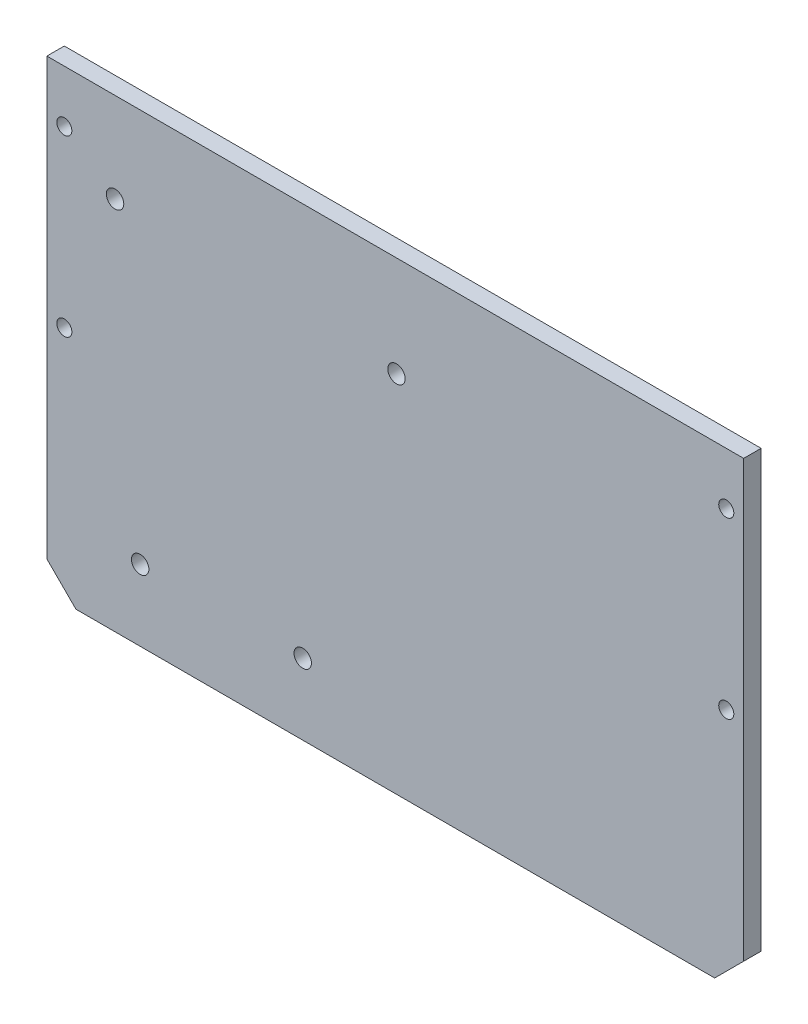
ISO-10303-21;
HEADER;
FILE_DESCRIPTION(('STEP AP214'),'2;1');
FILE_NAME('part.step','',(''),(''),'','','');
FILE_SCHEMA(('AUTOMOTIVE_DESIGN { 1 0 10303 214 1 1 1 1 }'));
ENDSEC;
DATA;
#1=APPLICATION_CONTEXT('core data for automotive mechanical design processes');
#2=APPLICATION_PROTOCOL_DEFINITION('international standard','automotive_design',2000,#1);
#3=PRODUCT_CONTEXT('',#1,'mechanical');
#4=PRODUCT('Part','Part','',(#3));
#5=PRODUCT_RELATED_PRODUCT_CATEGORY('part','',(#4));
#6=PRODUCT_DEFINITION_FORMATION('','',#4);
#7=PRODUCT_DEFINITION_CONTEXT('part definition',#1,'design');
#8=PRODUCT_DEFINITION('design','',#6,#7);
#9=PRODUCT_DEFINITION_SHAPE('','',#8);
#10=(LENGTH_UNIT() NAMED_UNIT(*) SI_UNIT(.MILLI.,.METRE.));
#11=(NAMED_UNIT(*) PLANE_ANGLE_UNIT() SI_UNIT($,.RADIAN.));
#12=(NAMED_UNIT(*) SI_UNIT($,.STERADIAN.) SOLID_ANGLE_UNIT());
#13=UNCERTAINTY_MEASURE_WITH_UNIT(LENGTH_MEASURE(1.E-05),#10,'distance_accuracy_value','');
#14=(GEOMETRIC_REPRESENTATION_CONTEXT(3) GLOBAL_UNCERTAINTY_ASSIGNED_CONTEXT((#13)) GLOBAL_UNIT_ASSIGNED_CONTEXT((#10,
#11,#12)) REPRESENTATION_CONTEXT('',''));
#15=CARTESIAN_POINT('',(0.,0.,0.));
#16=DIRECTION('',(0.,0.,1.));
#17=DIRECTION('',(1.,0.,0.));
#18=AXIS2_PLACEMENT_3D('',#15,#16,#17);
#19=CARTESIAN_POINT('',(60.,40.,3.));
#20=DIRECTION('',(-1.,0.,0.));
#21=DIRECTION('',(0.,-1.,0.));
#22=AXIS2_PLACEMENT_3D('',#19,#20,#21);
#23=PLANE('',#22);
#24=DIRECTION('',(0.,1.,0.));
#25=VECTOR('',#24,1.);
#26=CARTESIAN_POINT('',(60.,40.,3.));
#27=LINE('',#26,#25);
#28=CARTESIAN_POINT('',(60.,-35.,3.));
#29=VERTEX_POINT('',#28);
#30=CARTESIAN_POINT('',(60.,40.,3.));
#31=VERTEX_POINT('',#30);
#32=EDGE_CURVE('E91',#29,#31,#27,.T.);
#33=ORIENTED_EDGE('',*,*,#32,.F.);
#34=DIRECTION('',(0.,0.,-1.));
#35=VECTOR('',#34,1.);
#36=CARTESIAN_POINT('',(60.,-35.,3.));
#37=LINE('',#36,#35);
#38=CARTESIAN_POINT('',(60.,-35.,0.));
#39=VERTEX_POINT('',#38);
#40=EDGE_CURVE('E114',#29,#39,#37,.T.);
#41=ORIENTED_EDGE('',*,*,#40,.T.);
#42=DIRECTION('',(0.,1.,0.));
#43=VECTOR('',#42,1.);
#44=CARTESIAN_POINT('',(60.,40.,0.));
#45=LINE('',#44,#43);
#46=CARTESIAN_POINT('',(60.,40.,0.));
#47=VERTEX_POINT('',#46);
#48=EDGE_CURVE('E112',#39,#47,#45,.T.);
#49=ORIENTED_EDGE('',*,*,#48,.T.);
#50=DIRECTION('',(0.,0.,-1.));
#51=VECTOR('',#50,1.);
#52=CARTESIAN_POINT('',(60.,40.,3.));
#53=LINE('',#52,#51);
#54=EDGE_CURVE('E106',#31,#47,#53,.T.);
#55=ORIENTED_EDGE('',*,*,#54,.F.);
#56=EDGE_LOOP('',(#33,#41,#49,#55));
#57=FACE_BOUND('',#56,.T.);
#58=ADVANCED_FACE('F37',(#57),#23,.F.);
#59=CARTESIAN_POINT('',(-60.,40.,3.));
#60=DIRECTION('',(0.,-1.,0.));
#61=DIRECTION('',(0.,0.,-1.));
#62=AXIS2_PLACEMENT_3D('',#59,#60,#61);
#63=PLANE('',#62);
#64=DIRECTION('',(-1.,0.,0.));
#65=VECTOR('',#64,1.);
#66=CARTESIAN_POINT('',(-60.,40.,0.));
#67=LINE('',#66,#65);
#68=CARTESIAN_POINT('',(-60.,40.,0.));
#69=VERTEX_POINT('',#68);
#70=EDGE_CURVE('E141',#47,#69,#67,.T.);
#71=ORIENTED_EDGE('',*,*,#70,.T.);
#72=DIRECTION('',(0.,0.,-1.));
#73=VECTOR('',#72,1.);
#74=CARTESIAN_POINT('',(-60.,40.,3.));
#75=LINE('',#74,#73);
#76=CARTESIAN_POINT('',(-60.,40.,3.));
#77=VERTEX_POINT('',#76);
#78=EDGE_CURVE('E108',#77,#69,#75,.T.);
#79=ORIENTED_EDGE('',*,*,#78,.F.);
#80=DIRECTION('',(-1.,0.,0.));
#81=VECTOR('',#80,1.);
#82=CARTESIAN_POINT('',(-60.,40.,3.));
#83=LINE('',#82,#81);
#84=EDGE_CURVE('E94',#31,#77,#83,.T.);
#85=ORIENTED_EDGE('',*,*,#84,.F.);
#86=ORIENTED_EDGE('',*,*,#54,.T.);
#87=EDGE_LOOP('',(#71,#79,#85,#86));
#88=FACE_BOUND('',#87,.T.);
#89=ADVANCED_FACE('F105',(#88),#63,.F.);
#90=CARTESIAN_POINT('',(-60.,40.,3.));
#91=DIRECTION('',(1.,0.,0.));
#92=DIRECTION('',(0.,0.,-1.));
#93=AXIS2_PLACEMENT_3D('',#90,#91,#92);
#94=PLANE('',#93);
#95=DIRECTION('',(0.,-1.,0.));
#96=VECTOR('',#95,1.);
#97=CARTESIAN_POINT('',(-60.,40.,0.));
#98=LINE('',#97,#96);
#99=CARTESIAN_POINT('',(-60.,-35.,0.));
#100=VERTEX_POINT('',#99);
#101=EDGE_CURVE('E139',#69,#100,#98,.T.);
#102=ORIENTED_EDGE('',*,*,#101,.T.);
#103=DIRECTION('',(0.,0.,1.));
#104=VECTOR('',#103,1.);
#105=CARTESIAN_POINT('',(-60.,-35.,3.));
#106=LINE('',#105,#104);
#107=CARTESIAN_POINT('',(-60.,-35.,3.));
#108=VERTEX_POINT('',#107);
#109=EDGE_CURVE('E11',#100,#108,#106,.T.);
#110=ORIENTED_EDGE('',*,*,#109,.T.);
#111=DIRECTION('',(0.,-1.,0.));
#112=VECTOR('',#111,1.);
#113=CARTESIAN_POINT('',(-60.,40.,3.));
#114=LINE('',#113,#112);
#115=EDGE_CURVE('E109',#77,#108,#114,.T.);
#116=ORIENTED_EDGE('',*,*,#115,.F.);
#117=ORIENTED_EDGE('',*,*,#78,.T.);
#118=EDGE_LOOP('',(#102,#110,#116,#117));
#119=FACE_BOUND('',#118,.T.);
#120=ADVANCED_FACE('F140',(#119),#94,.F.);
#121=CARTESIAN_POINT('',(-60.,-40.,3.));
#122=DIRECTION('',(0.,1.,0.));
#123=DIRECTION('',(0.,0.,1.));
#124=AXIS2_PLACEMENT_3D('',#121,#122,#123);
#125=PLANE('',#124);
#126=DIRECTION('',(1.,0.,0.));
#127=VECTOR('',#126,1.);
#128=CARTESIAN_POINT('',(-60.,-40.,0.));
#129=LINE('',#128,#127);
#130=CARTESIAN_POINT('',(-55.,-40.,0.));
#131=VERTEX_POINT('',#130);
#132=CARTESIAN_POINT('',(55.,-40.,0.));
#133=VERTEX_POINT('',#132);
#134=EDGE_CURVE('E101',#131,#133,#129,.T.);
#135=ORIENTED_EDGE('',*,*,#134,.T.);
#136=DIRECTION('',(0.,0.,1.));
#137=VECTOR('',#136,1.);
#138=CARTESIAN_POINT('',(55.,-40.,3.));
#139=LINE('',#138,#137);
#140=CARTESIAN_POINT('',(55.,-40.,3.));
#141=VERTEX_POINT('',#140);
#142=EDGE_CURVE('E58',#133,#141,#139,.T.);
#143=ORIENTED_EDGE('',*,*,#142,.T.);
#144=DIRECTION('',(1.,0.,0.));
#145=VECTOR('',#144,1.);
#146=CARTESIAN_POINT('',(-60.,-40.,3.));
#147=LINE('',#146,#145);
#148=CARTESIAN_POINT('',(-55.,-40.,3.));
#149=VERTEX_POINT('',#148);
#150=EDGE_CURVE('E118',#149,#141,#147,.T.);
#151=ORIENTED_EDGE('',*,*,#150,.F.);
#152=DIRECTION('',(0.,0.,-1.));
#153=VECTOR('',#152,1.);
#154=CARTESIAN_POINT('',(-55.,-40.,3.));
#155=LINE('',#154,#153);
#156=EDGE_CURVE('E125',#149,#131,#155,.T.);
#157=ORIENTED_EDGE('',*,*,#156,.T.);
#158=EDGE_LOOP('',(#135,#143,#151,#157));
#159=FACE_BOUND('',#158,.T.);
#160=ADVANCED_FACE('F133',(#159),#125,.F.);
#161=CARTESIAN_POINT('',(0.,0.,3.));
#162=DIRECTION('',(0.,0.,1.));
#163=DIRECTION('',(1.,0.,0.));
#164=AXIS2_PLACEMENT_3D('',#161,#162,#163);
#165=PLANE('',#164);
#166=CARTESIAN_POINT('',(-15.9374364378945,-27.771775861688,3.));
#167=DIRECTION('',(0.,0.,1.));
#168=DIRECTION('',(1.,0.,0.));
#169=AXIS2_PLACEMENT_3D('',#166,#167,#168);
#170=CIRCLE('',#169,1.5);
#171=CARTESIAN_POINT('',(-14.4374364378945,-27.771775861688,3.));
#172=VERTEX_POINT('',#171);
#173=EDGE_CURVE('E190',#172,#172,#170,.T.);
#174=ORIENTED_EDGE('',*,*,#173,.F.);
#175=EDGE_LOOP('',(#174));
#176=FACE_BOUND('',#175,.T.);
#177=CARTESIAN_POINT('',(-48.258865009323,24.5500671400836,3.));
#178=DIRECTION('',(0.,0.,1.));
#179=DIRECTION('',(1.,0.,0.));
#180=AXIS2_PLACEMENT_3D('',#177,#178,#179);
#181=CIRCLE('',#180,1.5);
#182=CARTESIAN_POINT('',(-46.758865009323,24.5500671400836,3.));
#183=VERTEX_POINT('',#182);
#184=EDGE_CURVE('E184',#183,#183,#181,.T.);
#185=ORIENTED_EDGE('',*,*,#184,.F.);
#186=EDGE_LOOP('',(#185));
#187=FACE_BOUND('',#186,.T.);
#188=CARTESIAN_POINT('',(0.206206661875208,22.7097335003275,3.));
#189=DIRECTION('',(0.,0.,1.));
#190=DIRECTION('',(1.,0.,0.));
#191=AXIS2_PLACEMENT_3D('',#188,#189,#190);
#192=CIRCLE('',#191,1.5);
#193=CARTESIAN_POINT('',(1.70620666187521,22.7097335003275,3.));
#194=VERTEX_POINT('',#193);
#195=EDGE_CURVE('E178',#194,#194,#192,.T.);
#196=ORIENTED_EDGE('',*,*,#195,.F.);
#197=EDGE_LOOP('',(#196));
#198=FACE_BOUND('',#197,.T.);
#199=CARTESIAN_POINT('',(-43.9374364378945,-27.771775861688,3.));
#200=DIRECTION('',(0.,0.,1.));
#201=DIRECTION('',(1.,0.,0.));
#202=AXIS2_PLACEMENT_3D('',#199,#200,#201);
#203=CIRCLE('',#202,1.5);
#204=CARTESIAN_POINT('',(-42.4374364378945,-27.771775861688,3.));
#205=VERTEX_POINT('',#204);
#206=EDGE_CURVE('E172',#205,#205,#203,.T.);
#207=ORIENTED_EDGE('',*,*,#206,.F.);
#208=EDGE_LOOP('',(#207));
#209=FACE_BOUND('',#208,.T.);
#210=CARTESIAN_POINT('',(-57.,1.,3.));
#211=DIRECTION('',(0.,0.,1.));
#212=DIRECTION('',(1.,0.,0.));
#213=AXIS2_PLACEMENT_3D('',#210,#211,#212);
#214=CIRCLE('',#213,1.3);
#215=CARTESIAN_POINT('',(-55.7,1.,3.));
#216=VERTEX_POINT('',#215);
#217=EDGE_CURVE('E167',#216,#216,#214,.T.);
#218=ORIENTED_EDGE('',*,*,#217,.F.);
#219=EDGE_LOOP('',(#218));
#220=FACE_BOUND('',#219,.T.);
#221=CARTESIAN_POINT('',(57.,31.,3.));
#222=DIRECTION('',(0.,0.,1.));
#223=DIRECTION('',(-1.,0.,0.));
#224=AXIS2_PLACEMENT_3D('',#221,#222,#223);
#225=CIRCLE('',#224,1.3);
#226=CARTESIAN_POINT('',(55.7,31.,3.));
#227=VERTEX_POINT('',#226);
#228=EDGE_CURVE('E161',#227,#227,#225,.T.);
#229=ORIENTED_EDGE('',*,*,#228,.F.);
#230=EDGE_LOOP('',(#229));
#231=FACE_BOUND('',#230,.T.);
#232=CARTESIAN_POINT('',(57.,1.00000000000002,3.));
#233=DIRECTION('',(0.,0.,1.));
#234=DIRECTION('',(-1.,0.,0.));
#235=AXIS2_PLACEMENT_3D('',#232,#233,#234);
#236=CIRCLE('',#235,1.3);
#237=CARTESIAN_POINT('',(55.7,1.00000000000002,3.));
#238=VERTEX_POINT('',#237);
#239=EDGE_CURVE('E154',#238,#238,#236,.T.);
#240=ORIENTED_EDGE('',*,*,#239,.F.);
#241=EDGE_LOOP('',(#240));
#242=FACE_BOUND('',#241,.T.);
#243=CARTESIAN_POINT('',(-57.,31.,3.));
#244=DIRECTION('',(0.,0.,1.));
#245=DIRECTION('',(1.,0.,0.));
#246=AXIS2_PLACEMENT_3D('',#243,#244,#245);
#247=CIRCLE('',#246,1.3);
#248=CARTESIAN_POINT('',(-55.7,31.,3.));
#249=VERTEX_POINT('',#248);
#250=EDGE_CURVE('E148',#249,#249,#247,.T.);
#251=ORIENTED_EDGE('',*,*,#250,.F.);
#252=EDGE_LOOP('',(#251));
#253=FACE_BOUND('',#252,.T.);
#254=ORIENTED_EDGE('',*,*,#150,.T.);
#255=DIRECTION('',(-0.70710678118655,-0.707106781186546,0.));
#256=VECTOR('',#255,1.);
#257=CARTESIAN_POINT('',(47.4999999999998,-47.5000000000001,3.));
#258=LINE('',#257,#256);
#259=EDGE_CURVE('E45',#141,#29,#258,.F.);
#260=ORIENTED_EDGE('',*,*,#259,.T.);
#261=ORIENTED_EDGE('',*,*,#32,.T.);
#262=ORIENTED_EDGE('',*,*,#84,.T.);
#263=ORIENTED_EDGE('',*,*,#115,.T.);
#264=DIRECTION('',(-0.707106781186546,0.707106781186549,0.));
#265=VECTOR('',#264,1.);
#266=CARTESIAN_POINT('',(-47.5000000000001,-47.4999999999999,3.));
#267=LINE('',#266,#265);
#268=EDGE_CURVE('E129',#108,#149,#267,.F.);
#269=ORIENTED_EDGE('',*,*,#268,.T.);
#270=EDGE_LOOP('',(#254,#260,#261,#262,#263,#269));
#271=FACE_BOUND('',#270,.T.);
#272=ADVANCED_FACE('F93',(#176,#187,#198,#209,#220,#231,#242,#253,#271),#165,.T.);
#273=CARTESIAN_POINT('',(0.,0.,0.));
#274=DIRECTION('',(0.,0.,1.));
#275=DIRECTION('',(1.,0.,0.));
#276=AXIS2_PLACEMENT_3D('',#273,#274,#275);
#277=PLANE('',#276);
#278=CARTESIAN_POINT('',(-15.9374364378945,-27.771775861688,0.));
#279=DIRECTION('',(0.,0.,1.));
#280=DIRECTION('',(1.,0.,0.));
#281=AXIS2_PLACEMENT_3D('',#278,#279,#280);
#282=CIRCLE('',#281,1.5);
#283=CARTESIAN_POINT('',(-14.4374364378945,-27.771775861688,0.));
#284=VERTEX_POINT('',#283);
#285=EDGE_CURVE('E175',#284,#284,#282,.T.);
#286=ORIENTED_EDGE('',*,*,#285,.T.);
#287=EDGE_LOOP('',(#286));
#288=FACE_BOUND('',#287,.T.);
#289=CARTESIAN_POINT('',(-48.258865009323,24.5500671400836,0.));
#290=DIRECTION('',(0.,0.,1.));
#291=DIRECTION('',(1.,0.,0.));
#292=AXIS2_PLACEMENT_3D('',#289,#290,#291);
#293=CIRCLE('',#292,1.5);
#294=CARTESIAN_POINT('',(-46.758865009323,24.5500671400836,0.));
#295=VERTEX_POINT('',#294);
#296=EDGE_CURVE('E187',#295,#295,#293,.T.);
#297=ORIENTED_EDGE('',*,*,#296,.T.);
#298=EDGE_LOOP('',(#297));
#299=FACE_BOUND('',#298,.T.);
#300=CARTESIAN_POINT('',(0.206206661875208,22.7097335003275,0.));
#301=DIRECTION('',(0.,0.,1.));
#302=DIRECTION('',(1.,0.,0.));
#303=AXIS2_PLACEMENT_3D('',#300,#301,#302);
#304=CIRCLE('',#303,1.5);
#305=CARTESIAN_POINT('',(1.70620666187521,22.7097335003275,0.));
#306=VERTEX_POINT('',#305);
#307=EDGE_CURVE('E181',#306,#306,#304,.T.);
#308=ORIENTED_EDGE('',*,*,#307,.T.);
#309=EDGE_LOOP('',(#308));
#310=FACE_BOUND('',#309,.T.);
#311=CARTESIAN_POINT('',(-43.9374364378945,-27.771775861688,0.));
#312=DIRECTION('',(0.,0.,1.));
#313=DIRECTION('',(1.,0.,0.));
#314=AXIS2_PLACEMENT_3D('',#311,#312,#313);
#315=CIRCLE('',#314,1.5);
#316=CARTESIAN_POINT('',(-42.4374364378945,-27.771775861688,0.));
#317=VERTEX_POINT('',#316);
#318=EDGE_CURVE('E158',#317,#317,#315,.T.);
#319=ORIENTED_EDGE('',*,*,#318,.T.);
#320=EDGE_LOOP('',(#319));
#321=FACE_BOUND('',#320,.T.);
#322=CARTESIAN_POINT('',(-57.,1.,0.));
#323=DIRECTION('',(0.,0.,1.));
#324=DIRECTION('',(1.,0.,0.));
#325=AXIS2_PLACEMENT_3D('',#322,#323,#324);
#326=CIRCLE('',#325,1.3);
#327=CARTESIAN_POINT('',(-55.7,1.,0.));
#328=VERTEX_POINT('',#327);
#329=EDGE_CURVE('E151',#328,#328,#326,.T.);
#330=ORIENTED_EDGE('',*,*,#329,.T.);
#331=EDGE_LOOP('',(#330));
#332=FACE_BOUND('',#331,.T.);
#333=CARTESIAN_POINT('',(57.,31.,0.));
#334=DIRECTION('',(0.,0.,1.));
#335=DIRECTION('',(-1.,0.,0.));
#336=AXIS2_PLACEMENT_3D('',#333,#334,#335);
#337=CIRCLE('',#336,1.3);
#338=CARTESIAN_POINT('',(55.7,31.,0.));
#339=VERTEX_POINT('',#338);
#340=EDGE_CURVE('E164',#339,#339,#337,.T.);
#341=ORIENTED_EDGE('',*,*,#340,.T.);
#342=EDGE_LOOP('',(#341));
#343=FACE_BOUND('',#342,.T.);
#344=CARTESIAN_POINT('',(57.,1.00000000000002,0.));
#345=DIRECTION('',(0.,0.,1.));
#346=DIRECTION('',(-1.,0.,0.));
#347=AXIS2_PLACEMENT_3D('',#344,#345,#346);
#348=CIRCLE('',#347,1.3);
#349=CARTESIAN_POINT('',(55.7,1.00000000000002,0.));
#350=VERTEX_POINT('',#349);
#351=EDGE_CURVE('E157',#350,#350,#348,.T.);
#352=ORIENTED_EDGE('',*,*,#351,.T.);
#353=EDGE_LOOP('',(#352));
#354=FACE_BOUND('',#353,.T.);
#355=CARTESIAN_POINT('',(-57.,31.,0.));
#356=DIRECTION('',(0.,0.,1.));
#357=DIRECTION('',(1.,0.,0.));
#358=AXIS2_PLACEMENT_3D('',#355,#356,#357);
#359=CIRCLE('',#358,1.3);
#360=CARTESIAN_POINT('',(-55.7,31.,0.));
#361=VERTEX_POINT('',#360);
#362=EDGE_CURVE('E145',#361,#361,#359,.T.);
#363=ORIENTED_EDGE('',*,*,#362,.T.);
#364=EDGE_LOOP('',(#363));
#365=FACE_BOUND('',#364,.T.);
#366=ORIENTED_EDGE('',*,*,#48,.F.);
#367=DIRECTION('',(0.70710678118655,0.707106781186546,0.));
#368=VECTOR('',#367,1.);
#369=CARTESIAN_POINT('',(60.,-35.,0.));
#370=LINE('',#369,#368);
#371=EDGE_CURVE('E123',#39,#133,#370,.F.);
#372=ORIENTED_EDGE('',*,*,#371,.T.);
#373=ORIENTED_EDGE('',*,*,#134,.F.);
#374=DIRECTION('',(0.707106781186546,-0.707106781186549,0.));
#375=VECTOR('',#374,1.);
#376=CARTESIAN_POINT('',(-55.,-40.,0.));
#377=LINE('',#376,#375);
#378=EDGE_CURVE('E116',#131,#100,#377,.F.);
#379=ORIENTED_EDGE('',*,*,#378,.T.);
#380=ORIENTED_EDGE('',*,*,#101,.F.);
#381=ORIENTED_EDGE('',*,*,#70,.F.);
#382=EDGE_LOOP('',(#366,#372,#373,#379,#380,#381));
#383=FACE_BOUND('',#382,.T.);
#384=ADVANCED_FACE('F138',(#288,#299,#310,#321,#332,#343,#354,#365,#383),#277,.F.);
#385=CARTESIAN_POINT('',(-57.,31.,0.));
#386=DIRECTION('',(0.,0.,1.));
#387=DIRECTION('',(1.,0.,0.));
#388=AXIS2_PLACEMENT_3D('',#385,#386,#387);
#389=CYLINDRICAL_SURFACE('',#388,1.3);
#390=ORIENTED_EDGE('',*,*,#362,.F.);
#391=EDGE_LOOP('',(#390));
#392=FACE_BOUND('',#391,.T.);
#393=ORIENTED_EDGE('',*,*,#250,.T.);
#394=EDGE_LOOP('',(#393));
#395=FACE_BOUND('',#394,.T.);
#396=ADVANCED_FACE('F223',(#392,#395),#389,.F.);
#397=CARTESIAN_POINT('',(57.,1.00000000000002,0.));
#398=DIRECTION('',(0.,0.,1.));
#399=DIRECTION('',(1.,0.,0.));
#400=AXIS2_PLACEMENT_3D('',#397,#398,#399);
#401=CYLINDRICAL_SURFACE('',#400,1.3);
#402=ORIENTED_EDGE('',*,*,#351,.F.);
#403=EDGE_LOOP('',(#402));
#404=FACE_BOUND('',#403,.T.);
#405=ORIENTED_EDGE('',*,*,#239,.T.);
#406=EDGE_LOOP('',(#405));
#407=FACE_BOUND('',#406,.T.);
#408=ADVANCED_FACE('F225',(#404,#407),#401,.F.);
#409=CARTESIAN_POINT('',(57.,31.,0.));
#410=DIRECTION('',(0.,0.,1.));
#411=DIRECTION('',(1.,0.,0.));
#412=AXIS2_PLACEMENT_3D('',#409,#410,#411);
#413=CYLINDRICAL_SURFACE('',#412,1.3);
#414=ORIENTED_EDGE('',*,*,#340,.F.);
#415=EDGE_LOOP('',(#414));
#416=FACE_BOUND('',#415,.T.);
#417=ORIENTED_EDGE('',*,*,#228,.T.);
#418=EDGE_LOOP('',(#417));
#419=FACE_BOUND('',#418,.T.);
#420=ADVANCED_FACE('F232',(#416,#419),#413,.F.);
#421=CARTESIAN_POINT('',(-57.,1.,0.));
#422=DIRECTION('',(0.,0.,1.));
#423=DIRECTION('',(1.,0.,0.));
#424=AXIS2_PLACEMENT_3D('',#421,#422,#423);
#425=CYLINDRICAL_SURFACE('',#424,1.3);
#426=ORIENTED_EDGE('',*,*,#329,.F.);
#427=EDGE_LOOP('',(#426));
#428=FACE_BOUND('',#427,.T.);
#429=ORIENTED_EDGE('',*,*,#217,.T.);
#430=EDGE_LOOP('',(#429));
#431=FACE_BOUND('',#430,.T.);
#432=ADVANCED_FACE('F323',(#428,#431),#425,.F.);
#433=CARTESIAN_POINT('',(-43.9374364378945,-27.771775861688,0.));
#434=DIRECTION('',(0.,0.,1.));
#435=DIRECTION('',(1.,0.,0.));
#436=AXIS2_PLACEMENT_3D('',#433,#434,#435);
#437=CYLINDRICAL_SURFACE('',#436,1.5);
#438=ORIENTED_EDGE('',*,*,#318,.F.);
#439=EDGE_LOOP('',(#438));
#440=FACE_BOUND('',#439,.T.);
#441=ORIENTED_EDGE('',*,*,#206,.T.);
#442=EDGE_LOOP('',(#441));
#443=FACE_BOUND('',#442,.T.);
#444=ADVANCED_FACE('F313',(#440,#443),#437,.F.);
#445=CARTESIAN_POINT('',(0.206206661875208,22.7097335003275,0.));
#446=DIRECTION('',(0.,0.,1.));
#447=DIRECTION('',(1.,0.,0.));
#448=AXIS2_PLACEMENT_3D('',#445,#446,#447);
#449=CYLINDRICAL_SURFACE('',#448,1.5);
#450=ORIENTED_EDGE('',*,*,#307,.F.);
#451=EDGE_LOOP('',(#450));
#452=FACE_BOUND('',#451,.T.);
#453=ORIENTED_EDGE('',*,*,#195,.T.);
#454=EDGE_LOOP('',(#453));
#455=FACE_BOUND('',#454,.T.);
#456=ADVANCED_FACE('F303',(#452,#455),#449,.F.);
#457=CARTESIAN_POINT('',(-48.258865009323,24.5500671400836,0.));
#458=DIRECTION('',(0.,0.,1.));
#459=DIRECTION('',(1.,0.,0.));
#460=AXIS2_PLACEMENT_3D('',#457,#458,#459);
#461=CYLINDRICAL_SURFACE('',#460,1.5);
#462=ORIENTED_EDGE('',*,*,#296,.F.);
#463=EDGE_LOOP('',(#462));
#464=FACE_BOUND('',#463,.T.);
#465=ORIENTED_EDGE('',*,*,#184,.T.);
#466=EDGE_LOOP('',(#465));
#467=FACE_BOUND('',#466,.T.);
#468=ADVANCED_FACE('F202',(#464,#467),#461,.F.);
#469=CARTESIAN_POINT('',(-15.9374364378945,-27.771775861688,0.));
#470=DIRECTION('',(0.,0.,1.));
#471=DIRECTION('',(1.,0.,0.));
#472=AXIS2_PLACEMENT_3D('',#469,#470,#471);
#473=CYLINDRICAL_SURFACE('',#472,1.5);
#474=ORIENTED_EDGE('',*,*,#285,.F.);
#475=EDGE_LOOP('',(#474));
#476=FACE_BOUND('',#475,.T.);
#477=ORIENTED_EDGE('',*,*,#173,.T.);
#478=EDGE_LOOP('',(#477));
#479=FACE_BOUND('',#478,.T.);
#480=ADVANCED_FACE('F198',(#476,#479),#473,.F.);
#481=CARTESIAN_POINT('',(60.,-35.,3.));
#482=DIRECTION('',(-0.707106781186545,0.707106781186549,0.));
#483=DIRECTION('',(0.,0.,-1.));
#484=AXIS2_PLACEMENT_3D('',#481,#482,#483);
#485=PLANE('',#484);
#486=ORIENTED_EDGE('',*,*,#259,.F.);
#487=ORIENTED_EDGE('',*,*,#142,.F.);
#488=ORIENTED_EDGE('',*,*,#371,.F.);
#489=ORIENTED_EDGE('',*,*,#40,.F.);
#490=EDGE_LOOP('',(#486,#487,#488,#489));
#491=FACE_BOUND('',#490,.T.);
#492=ADVANCED_FACE('F201',(#491),#485,.F.);
#493=CARTESIAN_POINT('',(-55.,-40.,3.));
#494=DIRECTION('',(0.707106781186549,0.707106781186545,0.));
#495=DIRECTION('',(0.,0.,-1.));
#496=AXIS2_PLACEMENT_3D('',#493,#494,#495);
#497=PLANE('',#496);
#498=ORIENTED_EDGE('',*,*,#268,.F.);
#499=ORIENTED_EDGE('',*,*,#109,.F.);
#500=ORIENTED_EDGE('',*,*,#378,.F.);
#501=ORIENTED_EDGE('',*,*,#156,.F.);
#502=EDGE_LOOP('',(#498,#499,#500,#501));
#503=FACE_BOUND('',#502,.T.);
#504=ADVANCED_FACE('F39',(#503),#497,.F.);
#505=CLOSED_SHELL('',(#58,#89,#120,#160,#272,#384,#396,#408,#420,#432,#444,#456,#468,#480,#492,#504));
#506=MANIFOLD_SOLID_BREP('B2',#505);
#507=ADVANCED_BREP_SHAPE_REPRESENTATION('',(#18,#506),#14);
#508=SHAPE_DEFINITION_REPRESENTATION(#9,#507);
ENDSEC;
END-ISO-10303-21;
